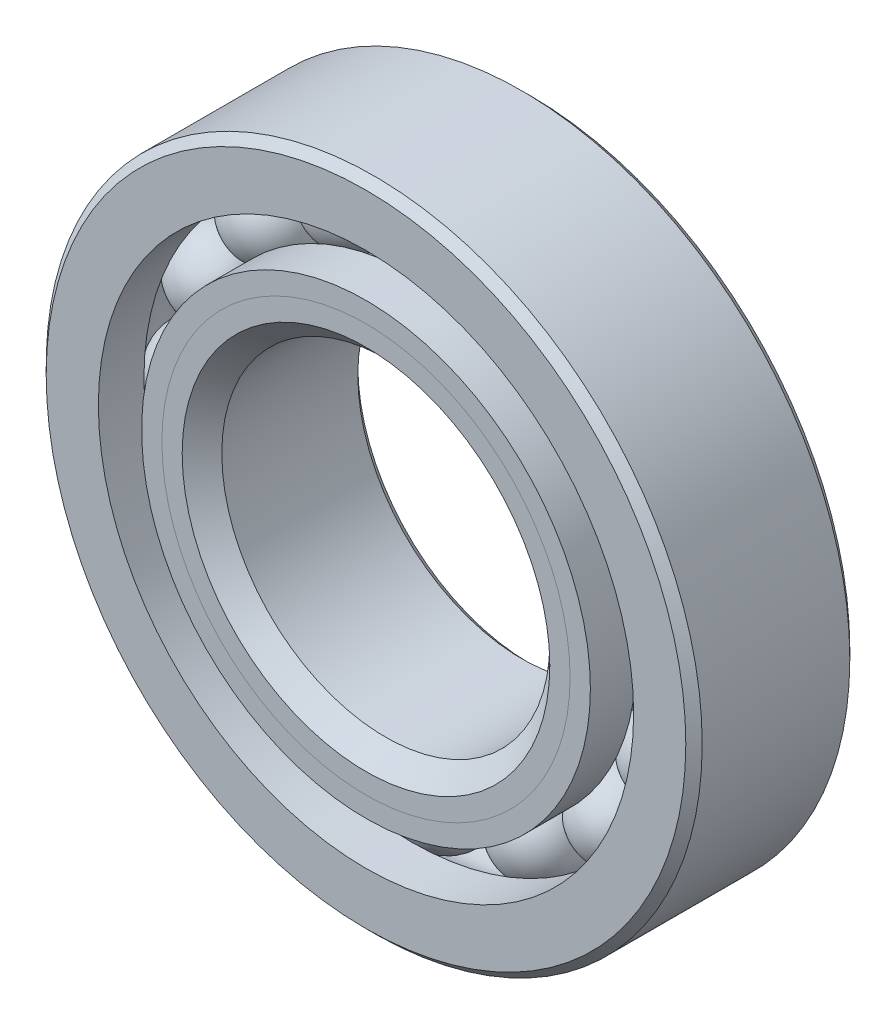
ISO-10303-21;
HEADER;
FILE_DESCRIPTION(('STEP AP214'),'2;1');
FILE_NAME('part.step','',(''),(''),'','','');
FILE_SCHEMA(('AUTOMOTIVE_DESIGN { 1 0 10303 214 1 1 1 1 }'));
ENDSEC;
DATA;
#1=APPLICATION_CONTEXT('core data for automotive mechanical design processes');
#2=APPLICATION_PROTOCOL_DEFINITION('international standard','automotive_design',2000,#1);
#3=PRODUCT_CONTEXT('',#1,'mechanical');
#4=PRODUCT('Part','Part','',(#3));
#5=PRODUCT_RELATED_PRODUCT_CATEGORY('part','',(#4));
#6=PRODUCT_DEFINITION_FORMATION('','',#4);
#7=PRODUCT_DEFINITION_CONTEXT('part definition',#1,'design');
#8=PRODUCT_DEFINITION('design','',#6,#7);
#9=PRODUCT_DEFINITION_SHAPE('','',#8);
#10=(LENGTH_UNIT() NAMED_UNIT(*) SI_UNIT(.MILLI.,.METRE.));
#11=(NAMED_UNIT(*) PLANE_ANGLE_UNIT() SI_UNIT($,.RADIAN.));
#12=(NAMED_UNIT(*) SI_UNIT($,.STERADIAN.) SOLID_ANGLE_UNIT());
#13=UNCERTAINTY_MEASURE_WITH_UNIT(LENGTH_MEASURE(1.E-05),#10,'distance_accuracy_value','');
#14=(GEOMETRIC_REPRESENTATION_CONTEXT(3) GLOBAL_UNCERTAINTY_ASSIGNED_CONTEXT((#13)) GLOBAL_UNIT_ASSIGNED_CONTEXT((#10,
#11,#12)) REPRESENTATION_CONTEXT('',''));
#15=CARTESIAN_POINT('',(0.,0.,0.));
#16=DIRECTION('',(0.,0.,1.));
#17=DIRECTION('',(1.,0.,0.));
#18=AXIS2_PLACEMENT_3D('',#15,#16,#17);
#19=CARTESIAN_POINT('',(-1.82252984663868,4.39997627358503,0.));
#20=DIRECTION('',(0.,0.,1.));
#21=DIRECTION('',(-0.382683432365077,0.923879532511292,0.));
#22=AXIS2_PLACEMENT_3D('',#19,#20,#21);
#23=SPHERICAL_SURFACE('',#22,0.820428356767388);
#24=CARTESIAN_POINT('',(-1.82252984663868,4.39997627358503,0.820428356767388));
#25=VERTEX_POINT('',#24);
#26=VERTEX_LOOP('',#25);
#27=FACE_BOUND('',#26,.T.);
#28=ADVANCED_FACE('F37',(#27),#23,.T.);
#29=CLOSED_SHELL('',(#28));
#30=MANIFOLD_SOLID_BREP('B2',#29);
#31=CARTESIAN_POINT('',(-3.36759604540089,3.36759604540097,0.));
#32=DIRECTION('',(0.,0.,1.));
#33=DIRECTION('',(-0.707106781186539,0.707106781186556,0.));
#34=AXIS2_PLACEMENT_3D('',#31,#32,#33);
#35=SPHERICAL_SURFACE('',#34,0.820428356767388);
#36=CARTESIAN_POINT('',(-3.36759604540089,3.36759604540097,0.820428356767388));
#37=VERTEX_POINT('',#36);
#38=VERTEX_LOOP('',#37);
#39=FACE_BOUND('',#38,.T.);
#40=ADVANCED_FACE('F57',(#39),#35,.T.);
#41=CLOSED_SHELL('',(#40));
#42=MANIFOLD_SOLID_BREP('B6',#41);
#43=CARTESIAN_POINT('',(-4.39997627358498,1.82252984663879,0.));
#44=DIRECTION('',(0.,0.,1.));
#45=DIRECTION('',(-0.923879532511283,0.3826834323651,0.));
#46=AXIS2_PLACEMENT_3D('',#43,#44,#45);
#47=SPHERICAL_SURFACE('',#46,0.820428356767388);
#48=CARTESIAN_POINT('',(-4.39997627358498,1.82252984663879,0.820428356767388));
#49=VERTEX_POINT('',#48);
#50=VERTEX_LOOP('',#49);
#51=FACE_BOUND('',#50,.T.);
#52=ADVANCED_FACE('F77',(#51),#47,.T.);
#53=CLOSED_SHELL('',(#52));
#54=MANIFOLD_SOLID_BREP('B33',#53);
#55=CARTESIAN_POINT('',(-4.7625,0.,0.));
#56=DIRECTION('',(0.,0.,1.));
#57=DIRECTION('',(-1.,0.,0.));
#58=AXIS2_PLACEMENT_3D('',#55,#56,#57);
#59=SPHERICAL_SURFACE('',#58,0.820428356767388);
#60=CARTESIAN_POINT('',(-4.7625,0.,0.820428356767388));
#61=VERTEX_POINT('',#60);
#62=VERTEX_LOOP('',#61);
#63=FACE_BOUND('',#62,.T.);
#64=ADVANCED_FACE('F97',(#63),#59,.T.);
#65=CLOSED_SHELL('',(#64));
#66=MANIFOLD_SOLID_BREP('B53',#65);
#67=CARTESIAN_POINT('',(-4.39997627358502,-1.8225298466387,0.));
#68=DIRECTION('',(0.,0.,1.));
#69=DIRECTION('',(-0.923879532511291,-0.382683432365081,0.));
#70=AXIS2_PLACEMENT_3D('',#67,#68,#69);
#71=SPHERICAL_SURFACE('',#70,0.820428356767388);
#72=CARTESIAN_POINT('',(-4.39997627358502,-1.8225298466387,0.820428356767388));
#73=VERTEX_POINT('',#72);
#74=VERTEX_LOOP('',#73);
#75=FACE_BOUND('',#74,.T.);
#76=ADVANCED_FACE('F117',(#75),#71,.T.);
#77=CLOSED_SHELL('',(#76));
#78=MANIFOLD_SOLID_BREP('B73',#77);
#79=CARTESIAN_POINT('',(-3.36759604540096,-3.3675960454009,0.));
#80=DIRECTION('',(0.,0.,1.));
#81=DIRECTION('',(-0.707106781186554,-0.707106781186541,0.));
#82=AXIS2_PLACEMENT_3D('',#79,#80,#81);
#83=SPHERICAL_SURFACE('',#82,0.820428356767388);
#84=CARTESIAN_POINT('',(-3.36759604540096,-3.3675960454009,0.820428356767388));
#85=VERTEX_POINT('',#84);
#86=VERTEX_LOOP('',#85);
#87=FACE_BOUND('',#86,.T.);
#88=ADVANCED_FACE('F148',(#87),#83,.T.);
#89=CLOSED_SHELL('',(#88));
#90=MANIFOLD_SOLID_BREP('B93',#89);
#91=CARTESIAN_POINT('',(-1.82252984663877,-4.39997627358499,0.));
#92=DIRECTION('',(0.,0.,1.));
#93=DIRECTION('',(-0.382683432365097,-0.923879532511284,0.));
#94=AXIS2_PLACEMENT_3D('',#91,#92,#93);
#95=SPHERICAL_SURFACE('',#94,0.820428356767388);
#96=CARTESIAN_POINT('',(-1.82252984663877,-4.39997627358499,0.820428356767388));
#97=VERTEX_POINT('',#96);
#98=VERTEX_LOOP('',#97);
#99=FACE_BOUND('',#98,.T.);
#100=ADVANCED_FACE('F179',(#99),#95,.T.);
#101=CLOSED_SHELL('',(#100));
#102=MANIFOLD_SOLID_BREP('B113',#101);
#103=CARTESIAN_POINT('',(0.,-4.7625,0.));
#104=DIRECTION('',(0.,0.,1.));
#105=DIRECTION('',(0.,-1.,0.));
#106=AXIS2_PLACEMENT_3D('',#103,#104,#105);
#107=SPHERICAL_SURFACE('',#106,0.820428356767388);
#108=CARTESIAN_POINT('',(0.,-4.7625,0.820428356767388));
#109=VERTEX_POINT('',#108);
#110=VERTEX_LOOP('',#109);
#111=FACE_BOUND('',#110,.T.);
#112=ADVANCED_FACE('F210',(#111),#107,.T.);
#113=CLOSED_SHELL('',(#112));
#114=MANIFOLD_SOLID_BREP('B144',#113);
#115=CARTESIAN_POINT('',(1.82252984663871,-4.39997627358501,0.));
#116=DIRECTION('',(0.,0.,1.));
#117=DIRECTION('',(0.382683432365084,-0.923879532511289,0.));
#118=AXIS2_PLACEMENT_3D('',#115,#116,#117);
#119=SPHERICAL_SURFACE('',#118,0.820428356767388);
#120=CARTESIAN_POINT('',(1.82252984663871,-4.39997627358501,0.820428356767388));
#121=VERTEX_POINT('',#120);
#122=VERTEX_LOOP('',#121);
#123=FACE_BOUND('',#122,.T.);
#124=ADVANCED_FACE('F241',(#123),#119,.T.);
#125=CLOSED_SHELL('',(#124));
#126=MANIFOLD_SOLID_BREP('B175',#125);
#127=CARTESIAN_POINT('',(3.36759604540091,-3.36759604540095,0.));
#128=DIRECTION('',(0.,0.,1.));
#129=DIRECTION('',(0.707106781186544,-0.707106781186551,0.));
#130=AXIS2_PLACEMENT_3D('',#127,#128,#129);
#131=SPHERICAL_SURFACE('',#130,0.820428356767388);
#132=CARTESIAN_POINT('',(3.36759604540091,-3.36759604540095,0.820428356767388));
#133=VERTEX_POINT('',#132);
#134=VERTEX_LOOP('',#133);
#135=FACE_BOUND('',#134,.T.);
#136=ADVANCED_FACE('F272',(#135),#131,.T.);
#137=CLOSED_SHELL('',(#136));
#138=MANIFOLD_SOLID_BREP('B206',#137);
#139=CARTESIAN_POINT('',(4.399976273585,-1.82252984663876,0.));
#140=DIRECTION('',(0.,0.,1.));
#141=DIRECTION('',(0.923879532511285,-0.382683432365094,0.));
#142=AXIS2_PLACEMENT_3D('',#139,#140,#141);
#143=SPHERICAL_SURFACE('',#142,0.820428356767388);
#144=CARTESIAN_POINT('',(4.399976273585,-1.82252984663876,0.820428356767388));
#145=VERTEX_POINT('',#144);
#146=VERTEX_LOOP('',#145);
#147=FACE_BOUND('',#146,.T.);
#148=ADVANCED_FACE('F303',(#147),#143,.T.);
#149=CLOSED_SHELL('',(#148));
#150=MANIFOLD_SOLID_BREP('B237',#149);
#151=CARTESIAN_POINT('',(4.7625,0.,0.));
#152=DIRECTION('',(0.,0.,1.));
#153=DIRECTION('',(1.,0.,0.));
#154=AXIS2_PLACEMENT_3D('',#151,#152,#153);
#155=SPHERICAL_SURFACE('',#154,0.820428356767388);
#156=CARTESIAN_POINT('',(4.7625,0.,0.820428356767388));
#157=VERTEX_POINT('',#156);
#158=VERTEX_LOOP('',#157);
#159=FACE_BOUND('',#158,.T.);
#160=ADVANCED_FACE('F334',(#159),#155,.T.);
#161=CLOSED_SHELL('',(#160));
#162=MANIFOLD_SOLID_BREP('B268',#161);
#163=CARTESIAN_POINT('',(4.39997627358501,1.82252984663873,0.));
#164=DIRECTION('',(0.,0.,1.));
#165=DIRECTION('',(0.923879532511288,0.382683432365087,0.));
#166=AXIS2_PLACEMENT_3D('',#163,#164,#165);
#167=SPHERICAL_SURFACE('',#166,0.820428356767388);
#168=CARTESIAN_POINT('',(4.39997627358501,1.82252984663873,0.820428356767388));
#169=VERTEX_POINT('',#168);
#170=VERTEX_LOOP('',#169);
#171=FACE_BOUND('',#170,.T.);
#172=ADVANCED_FACE('F365',(#171),#167,.T.);
#173=CLOSED_SHELL('',(#172));
#174=MANIFOLD_SOLID_BREP('B299',#173);
#175=CARTESIAN_POINT('',(3.36759604540094,3.36759604540093,0.));
#176=DIRECTION('',(0.,0.,1.));
#177=DIRECTION('',(0.707106781186549,0.707106781186546,0.));
#178=AXIS2_PLACEMENT_3D('',#175,#176,#177);
#179=SPHERICAL_SURFACE('',#178,0.820428356767388);
#180=CARTESIAN_POINT('',(3.36759604540094,3.36759604540093,0.820428356767388));
#181=VERTEX_POINT('',#180);
#182=VERTEX_LOOP('',#181);
#183=FACE_BOUND('',#182,.T.);
#184=ADVANCED_FACE('F396',(#183),#179,.T.);
#185=CLOSED_SHELL('',(#184));
#186=MANIFOLD_SOLID_BREP('B330',#185);
#187=CARTESIAN_POINT('',(1.82252984663874,4.399976273585,0.));
#188=DIRECTION('',(0.,0.,1.));
#189=DIRECTION('',(0.382683432365091,0.923879532511287,0.));
#190=AXIS2_PLACEMENT_3D('',#187,#188,#189);
#191=SPHERICAL_SURFACE('',#190,0.820428356767388);
#192=CARTESIAN_POINT('',(1.82252984663874,4.399976273585,0.820428356767388));
#193=VERTEX_POINT('',#192);
#194=VERTEX_LOOP('',#193);
#195=FACE_BOUND('',#194,.T.);
#196=ADVANCED_FACE('F427',(#195),#191,.T.);
#197=CLOSED_SHELL('',(#196));
#198=MANIFOLD_SOLID_BREP('B361',#197);
#199=CARTESIAN_POINT('',(0.,4.7625,0.));
#200=DIRECTION('',(0.,0.,1.));
#201=DIRECTION('',(0.,1.,0.));
#202=AXIS2_PLACEMENT_3D('',#199,#200,#201);
#203=SPHERICAL_SURFACE('',#202,0.820428356767388);
#204=CARTESIAN_POINT('',(0.,4.7625,0.820428356767388));
#205=VERTEX_POINT('',#204);
#206=VERTEX_LOOP('',#205);
#207=FACE_BOUND('',#206,.T.);
#208=ADVANCED_FACE('F460',(#207),#203,.T.);
#209=CLOSED_SHELL('',(#208));
#210=MANIFOLD_SOLID_BREP('B392',#209);
#211=CARTESIAN_POINT('',(0.,3.95117725146749,1.5875));
#212=DIRECTION('',(0.,0.,-1.));
#213=DIRECTION('',(-1.,0.,0.));
#214=AXIS2_PLACEMENT_3D('',#211,#212,#213);
#215=PLANE('',#214);
#216=CARTESIAN_POINT('',(0.,0.,1.5875));
#217=DIRECTION('',(0.,0.,1.));
#218=DIRECTION('',(1.,0.,0.));
#219=AXIS2_PLACEMENT_3D('',#216,#217,#218);
#220=CIRCLE('',#219,3.55853582161631);
#221=CARTESIAN_POINT('',(3.55853582161631,0.,1.5875));
#222=VERTEX_POINT('',#221);
#223=EDGE_CURVE('E514',#222,#222,#220,.T.);
#224=ORIENTED_EDGE('',*,*,#223,.F.);
#225=EDGE_LOOP('',(#224));
#226=FACE_BOUND('',#225,.T.);
#227=CARTESIAN_POINT('',(0.,0.,1.5875));
#228=DIRECTION('',(0.,0.,1.));
#229=DIRECTION('',(1.,0.,0.));
#230=AXIS2_PLACEMENT_3D('',#227,#228,#229);
#231=CIRCLE('',#230,3.95117725146749);
#232=CARTESIAN_POINT('',(3.95117725146749,0.,1.5875));
#233=VERTEX_POINT('',#232);
#234=EDGE_CURVE('E459',#233,#233,#231,.T.);
#235=ORIENTED_EDGE('',*,*,#234,.T.);
#236=EDGE_LOOP('',(#235));
#237=FACE_BOUND('',#236,.T.);
#238=ADVANCED_FACE('F480',(#226,#237),#215,.F.);
#239=CARTESIAN_POINT('',(0.,0.,1.19485857014881));
#240=DIRECTION('',(0.,0.,1.));
#241=DIRECTION('',(1.,0.,0.));
#242=AXIS2_PLACEMENT_3D('',#239,#240,#241);
#243=CONICAL_SURFACE('',#242,3.55853582161631,0.78539816339745);
#244=ORIENTED_EDGE('',*,*,#234,.F.);
#245=EDGE_LOOP('',(#244));
#246=FACE_BOUND('',#245,.T.);
#247=CARTESIAN_POINT('',(0.,0.,1.19485857014881));
#248=DIRECTION('',(0.,0.,1.));
#249=DIRECTION('',(1.,0.,0.));
#250=AXIS2_PLACEMENT_3D('',#247,#248,#249);
#251=CIRCLE('',#250,3.55853582161631);
#252=CARTESIAN_POINT('',(3.55853582161631,0.,1.19485857014881));
#253=VERTEX_POINT('',#252);
#254=EDGE_CURVE('E486',#253,#253,#251,.T.);
#255=ORIENTED_EDGE('',*,*,#254,.T.);
#256=EDGE_LOOP('',(#255));
#257=FACE_BOUND('',#256,.T.);
#258=ADVANCED_FACE('F521',(#246,#257),#243,.T.);
#259=CARTESIAN_POINT('',(0.,0.,1.5875));
#260=DIRECTION('',(0.,0.,1.));
#261=DIRECTION('',(1.,0.,0.));
#262=AXIS2_PLACEMENT_3D('',#259,#260,#261);
#263=CYLINDRICAL_SURFACE('',#262,3.55853582161631);
#264=ORIENTED_EDGE('',*,*,#254,.F.);
#265=EDGE_LOOP('',(#264));
#266=FACE_BOUND('',#265,.T.);
#267=CARTESIAN_POINT('',(0.,0.,0.));
#268=DIRECTION('',(0.,0.,1.));
#269=DIRECTION('',(1.,0.,0.));
#270=AXIS2_PLACEMENT_3D('',#267,#268,#269);
#271=CIRCLE('',#270,3.55853582161631);
#272=CARTESIAN_POINT('',(3.55853582161631,0.,0.));
#273=VERTEX_POINT('',#272);
#274=EDGE_CURVE('E490',#273,#273,#271,.T.);
#275=ORIENTED_EDGE('',*,*,#274,.T.);
#276=EDGE_LOOP('',(#275));
#277=FACE_BOUND('',#276,.T.);
#278=ADVANCED_FACE('F525',(#266,#277),#263,.T.);
#279=CARTESIAN_POINT('',(0.,3.55853582161631,0.));
#280=DIRECTION('',(0.,0.,-1.));
#281=DIRECTION('',(-1.,0.,0.));
#282=AXIS2_PLACEMENT_3D('',#279,#280,#281);
#283=PLANE('',#282);
#284=ORIENTED_EDGE('',*,*,#274,.F.);
#285=EDGE_LOOP('',(#284));
#286=FACE_BOUND('',#285,.T.);
#287=CARTESIAN_POINT('',(0.,0.,0.));
#288=DIRECTION('',(0.,0.,1.));
#289=DIRECTION('',(1.,0.,0.));
#290=AXIS2_PLACEMENT_3D('',#287,#288,#289);
#291=CIRCLE('',#290,3.94207164323261);
#292=CARTESIAN_POINT('',(3.94207164323261,0.,0.));
#293=VERTEX_POINT('',#292);
#294=EDGE_CURVE('E494',#293,#293,#291,.T.);
#295=ORIENTED_EDGE('',*,*,#294,.T.);
#296=EDGE_LOOP('',(#295));
#297=FACE_BOUND('',#296,.T.);
#298=ADVANCED_FACE('F530',(#286,#297),#283,.F.);
#299=CARTESIAN_POINT('',(0.,0.,0.));
#300=DIRECTION('',(0.,0.,1.));
#301=DIRECTION('',(1.,0.,0.));
#302=AXIS2_PLACEMENT_3D('',#299,#300,#301);
#303=TOROIDAL_SURFACE('',#302,4.7625,0.820428356767388);
#304=ORIENTED_EDGE('',*,*,#294,.F.);
#305=EDGE_LOOP('',(#304));
#306=FACE_BOUND('',#305,.T.);
#307=CARTESIAN_POINT('',(0.,0.,-0.705555555555556));
#308=DIRECTION('',(0.,0.,1.));
#309=DIRECTION('',(1.,0.,0.));
#310=AXIS2_PLACEMENT_3D('',#307,#308,#309);
#311=CIRCLE('',#310,4.34381868131868);
#312=CARTESIAN_POINT('',(4.34381868131868,0.,-0.705555555555556));
#313=VERTEX_POINT('',#312);
#314=EDGE_CURVE('E499',#313,#313,#311,.T.);
#315=ORIENTED_EDGE('',*,*,#314,.T.);
#316=EDGE_LOOP('',(#315));
#317=FACE_BOUND('',#316,.T.);
#318=ADVANCED_FACE('F536',(#306,#317),#303,.F.);
#319=CARTESIAN_POINT('',(0.,0.,1.5875));
#320=DIRECTION('',(0.,0.,1.));
#321=DIRECTION('',(1.,0.,0.));
#322=AXIS2_PLACEMENT_3D('',#319,#320,#321);
#323=CYLINDRICAL_SURFACE('',#322,4.34381868131868);
#324=ORIENTED_EDGE('',*,*,#314,.F.);
#325=EDGE_LOOP('',(#324));
#326=FACE_BOUND('',#325,.T.);
#327=CARTESIAN_POINT('',(0.,0.,-1.5875));
#328=DIRECTION('',(0.,0.,1.));
#329=DIRECTION('',(1.,0.,0.));
#330=AXIS2_PLACEMENT_3D('',#327,#328,#329);
#331=CIRCLE('',#330,4.34381868131868);
#332=CARTESIAN_POINT('',(4.34381868131868,0.,-1.5875));
#333=VERTEX_POINT('',#332);
#334=EDGE_CURVE('E502',#333,#333,#331,.T.);
#335=ORIENTED_EDGE('',*,*,#334,.T.);
#336=EDGE_LOOP('',(#335));
#337=FACE_BOUND('',#336,.T.);
#338=ADVANCED_FACE('F540',(#326,#337),#323,.T.);
#339=CARTESIAN_POINT('',(0.,3.33375,-1.5875));
#340=DIRECTION('',(0.,0.,1.));
#341=DIRECTION('',(1.,0.,0.));
#342=AXIS2_PLACEMENT_3D('',#339,#340,#341);
#343=PLANE('',#342);
#344=ORIENTED_EDGE('',*,*,#334,.F.);
#345=EDGE_LOOP('',(#344));
#346=FACE_BOUND('',#345,.T.);
#347=CARTESIAN_POINT('',(0.,0.,-1.5875));
#348=DIRECTION('',(0.,0.,1.));
#349=DIRECTION('',(1.,0.,0.));
#350=AXIS2_PLACEMENT_3D('',#347,#348,#349);
#351=CIRCLE('',#350,3.33375);
#352=CARTESIAN_POINT('',(3.33375,0.,-1.5875));
#353=VERTEX_POINT('',#352);
#354=EDGE_CURVE('E505',#353,#353,#351,.T.);
#355=ORIENTED_EDGE('',*,*,#354,.T.);
#356=EDGE_LOOP('',(#355));
#357=FACE_BOUND('',#356,.T.);
#358=ADVANCED_FACE('F544',(#346,#357),#343,.F.);
#359=CARTESIAN_POINT('',(0.,0.,-1.42875));
#360=DIRECTION('',(0.,0.,-1.));
#361=DIRECTION('',(-1.,0.,0.));
#362=AXIS2_PLACEMENT_3D('',#359,#360,#361);
#363=CONICAL_SURFACE('',#362,3.175,0.785398163397444);
#364=ORIENTED_EDGE('',*,*,#354,.F.);
#365=EDGE_LOOP('',(#364));
#366=FACE_BOUND('',#365,.T.);
#367=CARTESIAN_POINT('',(0.,0.,-1.42875));
#368=DIRECTION('',(0.,0.,1.));
#369=DIRECTION('',(1.,0.,0.));
#370=AXIS2_PLACEMENT_3D('',#367,#368,#369);
#371=CIRCLE('',#370,3.175);
#372=CARTESIAN_POINT('',(3.175,0.,-1.42875));
#373=VERTEX_POINT('',#372);
#374=EDGE_CURVE('E508',#373,#373,#371,.T.);
#375=ORIENTED_EDGE('',*,*,#374,.T.);
#376=EDGE_LOOP('',(#375));
#377=FACE_BOUND('',#376,.T.);
#378=ADVANCED_FACE('F548',(#366,#377),#363,.F.);
#379=CARTESIAN_POINT('',(0.,0.,1.5875));
#380=DIRECTION('',(0.,0.,1.));
#381=DIRECTION('',(1.,0.,0.));
#382=AXIS2_PLACEMENT_3D('',#379,#380,#381);
#383=CYLINDRICAL_SURFACE('',#382,3.175);
#384=ORIENTED_EDGE('',*,*,#374,.F.);
#385=EDGE_LOOP('',(#384));
#386=FACE_BOUND('',#385,.T.);
#387=CARTESIAN_POINT('',(0.,0.,1.2039641783837));
#388=DIRECTION('',(0.,0.,1.));
#389=DIRECTION('',(1.,0.,0.));
#390=AXIS2_PLACEMENT_3D('',#387,#388,#389);
#391=CIRCLE('',#390,3.175);
#392=CARTESIAN_POINT('',(3.175,0.,1.2039641783837));
#393=VERTEX_POINT('',#392);
#394=EDGE_CURVE('E511',#393,#393,#391,.T.);
#395=ORIENTED_EDGE('',*,*,#394,.T.);
#396=EDGE_LOOP('',(#395));
#397=FACE_BOUND('',#396,.T.);
#398=ADVANCED_FACE('F552',(#386,#397),#383,.F.);
#399=CARTESIAN_POINT('',(0.,0.,1.5875));
#400=DIRECTION('',(0.,0.,1.));
#401=DIRECTION('',(1.,0.,0.));
#402=AXIS2_PLACEMENT_3D('',#399,#400,#401);
#403=CONICAL_SURFACE('',#402,3.55853582161631,0.785398163397451);
#404=ORIENTED_EDGE('',*,*,#394,.F.);
#405=EDGE_LOOP('',(#404));
#406=FACE_BOUND('',#405,.T.);
#407=ORIENTED_EDGE('',*,*,#223,.T.);
#408=EDGE_LOOP('',(#407));
#409=FACE_BOUND('',#408,.T.);
#410=ADVANCED_FACE('F518',(#406,#409),#403,.F.);
#411=CLOSED_SHELL('',(#238,#258,#278,#298,#318,#338,#358,#378,#398,#410));
#412=MANIFOLD_SOLID_BREP('B423',#411);
#413=CARTESIAN_POINT('',(0.,4.34381868131868,1.5875));
#414=DIRECTION('',(0.,0.,-1.));
#415=DIRECTION('',(-1.,0.,0.));
#416=AXIS2_PLACEMENT_3D('',#413,#414,#415);
#417=PLANE('',#416);
#418=CARTESIAN_POINT('',(0.,0.,1.5875));
#419=DIRECTION('',(0.,0.,1.));
#420=DIRECTION('',(1.,0.,0.));
#421=AXIS2_PLACEMENT_3D('',#418,#419,#420);
#422=CIRCLE('',#421,3.95117725146749);
#423=CARTESIAN_POINT('',(3.95117725146749,0.,1.5875));
#424=VERTEX_POINT('',#423);
#425=EDGE_CURVE('E479',#424,#424,#422,.T.);
#426=ORIENTED_EDGE('',*,*,#425,.F.);
#427=EDGE_LOOP('',(#426));
#428=FACE_BOUND('',#427,.T.);
#429=CARTESIAN_POINT('',(0.,0.,1.5875));
#430=DIRECTION('',(0.,0.,1.));
#431=DIRECTION('',(1.,0.,0.));
#432=AXIS2_PLACEMENT_3D('',#429,#430,#431);
#433=CIRCLE('',#432,4.34381868131868);
#434=CARTESIAN_POINT('',(4.34381868131868,0.,1.5875));
#435=VERTEX_POINT('',#434);
#436=EDGE_CURVE('E660',#435,#435,#433,.T.);
#437=ORIENTED_EDGE('',*,*,#436,.T.);
#438=EDGE_LOOP('',(#437));
#439=FACE_BOUND('',#438,.T.);
#440=ADVANCED_FACE('F638',(#428,#439),#417,.F.);
#441=CARTESIAN_POINT('',(0.,0.,1.5875));
#442=DIRECTION('',(0.,0.,1.));
#443=DIRECTION('',(1.,0.,0.));
#444=AXIS2_PLACEMENT_3D('',#441,#442,#443);
#445=CONICAL_SURFACE('',#444,3.95117725146749,0.78539816339745);
#446=CARTESIAN_POINT('',(0.,0.,1.19485857014881));
#447=DIRECTION('',(0.,0.,1.));
#448=DIRECTION('',(1.,0.,0.));
#449=AXIS2_PLACEMENT_3D('',#446,#447,#448);
#450=CIRCLE('',#449,3.55853582161631);
#451=CARTESIAN_POINT('',(3.55853582161631,0.,1.19485857014881));
#452=VERTEX_POINT('',#451);
#453=EDGE_CURVE('E644',#452,#452,#450,.T.);
#454=ORIENTED_EDGE('',*,*,#453,.F.);
#455=EDGE_LOOP('',(#454));
#456=FACE_BOUND('',#455,.T.);
#457=ORIENTED_EDGE('',*,*,#425,.T.);
#458=EDGE_LOOP('',(#457));
#459=FACE_BOUND('',#458,.T.);
#460=ADVANCED_FACE('F685',(#456,#459),#445,.F.);
#461=CARTESIAN_POINT('',(0.,0.,1.5875));
#462=DIRECTION('',(0.,0.,1.));
#463=DIRECTION('',(1.,0.,0.));
#464=AXIS2_PLACEMENT_3D('',#461,#462,#463);
#465=CYLINDRICAL_SURFACE('',#464,3.55853582161631);
#466=CARTESIAN_POINT('',(0.,0.,0.));
#467=DIRECTION('',(0.,0.,1.));
#468=DIRECTION('',(1.,0.,0.));
#469=AXIS2_PLACEMENT_3D('',#466,#467,#468);
#470=CIRCLE('',#469,3.55853582161631);
#471=CARTESIAN_POINT('',(3.55853582161631,0.,0.));
#472=VERTEX_POINT('',#471);
#473=EDGE_CURVE('E648',#472,#472,#470,.T.);
#474=ORIENTED_EDGE('',*,*,#473,.F.);
#475=EDGE_LOOP('',(#474));
#476=FACE_BOUND('',#475,.T.);
#477=ORIENTED_EDGE('',*,*,#453,.T.);
#478=EDGE_LOOP('',(#477));
#479=FACE_BOUND('',#478,.T.);
#480=ADVANCED_FACE('F680',(#476,#479),#465,.F.);
#481=CARTESIAN_POINT('',(0.,3.55853582161631,0.));
#482=DIRECTION('',(0.,0.,1.));
#483=DIRECTION('',(1.,0.,0.));
#484=AXIS2_PLACEMENT_3D('',#481,#482,#483);
#485=PLANE('',#484);
#486=CARTESIAN_POINT('',(0.,0.,0.));
#487=DIRECTION('',(0.,0.,1.));
#488=DIRECTION('',(1.,0.,0.));
#489=AXIS2_PLACEMENT_3D('',#486,#487,#488);
#490=CIRCLE('',#489,3.94207164323261);
#491=CARTESIAN_POINT('',(3.94207164323261,0.,0.));
#492=VERTEX_POINT('',#491);
#493=EDGE_CURVE('E652',#492,#492,#490,.T.);
#494=ORIENTED_EDGE('',*,*,#493,.F.);
#495=EDGE_LOOP('',(#494));
#496=FACE_BOUND('',#495,.T.);
#497=ORIENTED_EDGE('',*,*,#473,.T.);
#498=EDGE_LOOP('',(#497));
#499=FACE_BOUND('',#498,.T.);
#500=ADVANCED_FACE('F674',(#496,#499),#485,.F.);
#501=CARTESIAN_POINT('',(0.,0.,0.));
#502=DIRECTION('',(0.,0.,1.));
#503=DIRECTION('',(1.,0.,0.));
#504=AXIS2_PLACEMENT_3D('',#501,#502,#503);
#505=TOROIDAL_SURFACE('',#504,4.7625,0.820428356767388);
#506=CARTESIAN_POINT('',(0.,0.,0.705555555555555));
#507=DIRECTION('',(0.,0.,1.));
#508=DIRECTION('',(1.,0.,0.));
#509=AXIS2_PLACEMENT_3D('',#506,#507,#508);
#510=CIRCLE('',#509,4.34381868131868);
#511=CARTESIAN_POINT('',(4.34381868131868,0.,0.705555555555555));
#512=VERTEX_POINT('',#511);
#513=EDGE_CURVE('E657',#512,#512,#510,.T.);
#514=ORIENTED_EDGE('',*,*,#513,.F.);
#515=EDGE_LOOP('',(#514));
#516=FACE_BOUND('',#515,.T.);
#517=ORIENTED_EDGE('',*,*,#493,.T.);
#518=EDGE_LOOP('',(#517));
#519=FACE_BOUND('',#518,.T.);
#520=ADVANCED_FACE('F668',(#516,#519),#505,.F.);
#521=CARTESIAN_POINT('',(0.,0.,1.5875));
#522=DIRECTION('',(0.,0.,1.));
#523=DIRECTION('',(1.,0.,0.));
#524=AXIS2_PLACEMENT_3D('',#521,#522,#523);
#525=CYLINDRICAL_SURFACE('',#524,4.34381868131868);
#526=ORIENTED_EDGE('',*,*,#436,.F.);
#527=EDGE_LOOP('',(#526));
#528=FACE_BOUND('',#527,.T.);
#529=ORIENTED_EDGE('',*,*,#513,.T.);
#530=EDGE_LOOP('',(#529));
#531=FACE_BOUND('',#530,.T.);
#532=ADVANCED_FACE('F665',(#528,#531),#525,.T.);
#533=CLOSED_SHELL('',(#440,#460,#480,#500,#520,#532));
#534=MANIFOLD_SOLID_BREP('B454',#533);
#535=CARTESIAN_POINT('',(0.,0.,1.42875));
#536=DIRECTION('',(0.,0.,-1.));
#537=DIRECTION('',(-1.,0.,0.));
#538=AXIS2_PLACEMENT_3D('',#535,#536,#537);
#539=CONICAL_SURFACE('',#538,6.35,0.785398163397446);
#540=CARTESIAN_POINT('',(0.,0.,1.5875));
#541=DIRECTION('',(0.,0.,1.));
#542=DIRECTION('',(1.,0.,0.));
#543=AXIS2_PLACEMENT_3D('',#540,#541,#542);
#544=CIRCLE('',#543,6.19125);
#545=CARTESIAN_POINT('',(6.19125,0.,1.5875));
#546=VERTEX_POINT('',#545);
#547=EDGE_CURVE('E757',#546,#546,#544,.T.);
#548=ORIENTED_EDGE('',*,*,#547,.F.);
#549=EDGE_LOOP('',(#548));
#550=FACE_BOUND('',#549,.T.);
#551=CARTESIAN_POINT('',(0.,0.,1.42875));
#552=DIRECTION('',(0.,0.,1.));
#553=DIRECTION('',(1.,0.,0.));
#554=AXIS2_PLACEMENT_3D('',#551,#552,#553);
#555=CIRCLE('',#554,6.35);
#556=CARTESIAN_POINT('',(6.35,0.,1.42875));
#557=VERTEX_POINT('',#556);
#558=EDGE_CURVE('E637',#557,#557,#555,.T.);
#559=ORIENTED_EDGE('',*,*,#558,.T.);
#560=EDGE_LOOP('',(#559));
#561=FACE_BOUND('',#560,.T.);
#562=ADVANCED_FACE('F729',(#550,#561),#539,.T.);
#563=CARTESIAN_POINT('',(0.,0.,1.5875));
#564=DIRECTION('',(0.,0.,1.));
#565=DIRECTION('',(1.,0.,0.));
#566=AXIS2_PLACEMENT_3D('',#563,#564,#565);
#567=CYLINDRICAL_SURFACE('',#566,6.35);
#568=ORIENTED_EDGE('',*,*,#558,.F.);
#569=EDGE_LOOP('',(#568));
#570=FACE_BOUND('',#569,.T.);
#571=CARTESIAN_POINT('',(0.,0.,-1.42875));
#572=DIRECTION('',(0.,0.,1.));
#573=DIRECTION('',(1.,0.,0.));
#574=AXIS2_PLACEMENT_3D('',#571,#572,#573);
#575=CIRCLE('',#574,6.35);
#576=CARTESIAN_POINT('',(6.35,0.,-1.42875));
#577=VERTEX_POINT('',#576);
#578=EDGE_CURVE('E735',#577,#577,#575,.T.);
#579=ORIENTED_EDGE('',*,*,#578,.T.);
#580=EDGE_LOOP('',(#579));
#581=FACE_BOUND('',#580,.T.);
#582=ADVANCED_FACE('F764',(#570,#581),#567,.T.);
#583=CARTESIAN_POINT('',(0.,0.,-1.5875));
#584=DIRECTION('',(0.,0.,1.));
#585=DIRECTION('',(1.,0.,0.));
#586=AXIS2_PLACEMENT_3D('',#583,#584,#585);
#587=CONICAL_SURFACE('',#586,6.19125,0.785398163397446);
#588=ORIENTED_EDGE('',*,*,#578,.F.);
#589=EDGE_LOOP('',(#588));
#590=FACE_BOUND('',#589,.T.);
#591=CARTESIAN_POINT('',(0.,0.,-1.5875));
#592=DIRECTION('',(0.,0.,1.));
#593=DIRECTION('',(1.,0.,0.));
#594=AXIS2_PLACEMENT_3D('',#591,#592,#593);
#595=CIRCLE('',#594,6.19125);
#596=CARTESIAN_POINT('',(6.19125,0.,-1.5875));
#597=VERTEX_POINT('',#596);
#598=EDGE_CURVE('E739',#597,#597,#595,.T.);
#599=ORIENTED_EDGE('',*,*,#598,.T.);
#600=EDGE_LOOP('',(#599));
#601=FACE_BOUND('',#600,.T.);
#602=ADVANCED_FACE('F768',(#590,#601),#587,.T.);
#603=CARTESIAN_POINT('',(0.,6.19125,-1.5875));
#604=DIRECTION('',(0.,0.,1.));
#605=DIRECTION('',(1.,0.,0.));
#606=AXIS2_PLACEMENT_3D('',#603,#604,#605);
#607=PLANE('',#606);
#608=ORIENTED_EDGE('',*,*,#598,.F.);
#609=EDGE_LOOP('',(#608));
#610=FACE_BOUND('',#609,.T.);
#611=CARTESIAN_POINT('',(0.,0.,-1.5875));
#612=DIRECTION('',(0.,0.,1.));
#613=DIRECTION('',(1.,0.,0.));
#614=AXIS2_PLACEMENT_3D('',#611,#612,#613);
#615=CIRCLE('',#614,5.18118131868132);
#616=CARTESIAN_POINT('',(5.18118131868132,0.,-1.5875));
#617=VERTEX_POINT('',#616);
#618=EDGE_CURVE('E743',#617,#617,#615,.T.);
#619=ORIENTED_EDGE('',*,*,#618,.T.);
#620=EDGE_LOOP('',(#619));
#621=FACE_BOUND('',#620,.T.);
#622=ADVANCED_FACE('F773',(#610,#621),#607,.F.);
#623=CARTESIAN_POINT('',(0.,0.,1.5875));
#624=DIRECTION('',(0.,0.,1.));
#625=DIRECTION('',(1.,0.,0.));
#626=AXIS2_PLACEMENT_3D('',#623,#624,#625);
#627=CYLINDRICAL_SURFACE('',#626,5.18118131868132);
#628=ORIENTED_EDGE('',*,*,#618,.F.);
#629=EDGE_LOOP('',(#628));
#630=FACE_BOUND('',#629,.T.);
#631=CARTESIAN_POINT('',(0.,0.,-0.705555555555556));
#632=DIRECTION('',(0.,0.,1.));
#633=DIRECTION('',(1.,0.,0.));
#634=AXIS2_PLACEMENT_3D('',#631,#632,#633);
#635=CIRCLE('',#634,5.18118131868132);
#636=CARTESIAN_POINT('',(5.18118131868132,0.,-0.705555555555556));
#637=VERTEX_POINT('',#636);
#638=EDGE_CURVE('E748',#637,#637,#635,.T.);
#639=ORIENTED_EDGE('',*,*,#638,.T.);
#640=EDGE_LOOP('',(#639));
#641=FACE_BOUND('',#640,.T.);
#642=ADVANCED_FACE('F779',(#630,#641),#627,.F.);
#643=CARTESIAN_POINT('',(0.,0.,0.));
#644=DIRECTION('',(0.,0.,1.));
#645=DIRECTION('',(1.,0.,0.));
#646=AXIS2_PLACEMENT_3D('',#643,#644,#645);
#647=TOROIDAL_SURFACE('',#646,4.7625,0.820428356767388);
#648=ORIENTED_EDGE('',*,*,#638,.F.);
#649=EDGE_LOOP('',(#648));
#650=FACE_BOUND('',#649,.T.);
#651=CARTESIAN_POINT('',(0.,0.,0.705555555555555));
#652=DIRECTION('',(0.,0.,1.));
#653=DIRECTION('',(1.,0.,0.));
#654=AXIS2_PLACEMENT_3D('',#651,#652,#653);
#655=CIRCLE('',#654,5.18118131868132);
#656=CARTESIAN_POINT('',(5.18118131868132,0.,0.705555555555555));
#657=VERTEX_POINT('',#656);
#658=EDGE_CURVE('E751',#657,#657,#655,.T.);
#659=ORIENTED_EDGE('',*,*,#658,.T.);
#660=EDGE_LOOP('',(#659));
#661=FACE_BOUND('',#660,.T.);
#662=ADVANCED_FACE('F783',(#650,#661),#647,.F.);
#663=CARTESIAN_POINT('',(0.,0.,1.5875));
#664=DIRECTION('',(0.,0.,1.));
#665=DIRECTION('',(1.,0.,0.));
#666=AXIS2_PLACEMENT_3D('',#663,#664,#665);
#667=CYLINDRICAL_SURFACE('',#666,5.18118131868132);
#668=ORIENTED_EDGE('',*,*,#658,.F.);
#669=EDGE_LOOP('',(#668));
#670=FACE_BOUND('',#669,.T.);
#671=CARTESIAN_POINT('',(0.,0.,1.5875));
#672=DIRECTION('',(0.,0.,1.));
#673=DIRECTION('',(1.,0.,0.));
#674=AXIS2_PLACEMENT_3D('',#671,#672,#673);
#675=CIRCLE('',#674,5.18118131868132);
#676=CARTESIAN_POINT('',(5.18118131868132,0.,1.5875));
#677=VERTEX_POINT('',#676);
#678=EDGE_CURVE('E754',#677,#677,#675,.T.);
#679=ORIENTED_EDGE('',*,*,#678,.T.);
#680=EDGE_LOOP('',(#679));
#681=FACE_BOUND('',#680,.T.);
#682=ADVANCED_FACE('F787',(#670,#681),#667,.F.);
#683=CARTESIAN_POINT('',(0.,6.19125,1.5875));
#684=DIRECTION('',(0.,0.,-1.));
#685=DIRECTION('',(-1.,0.,0.));
#686=AXIS2_PLACEMENT_3D('',#683,#684,#685);
#687=PLANE('',#686);
#688=ORIENTED_EDGE('',*,*,#678,.F.);
#689=EDGE_LOOP('',(#688));
#690=FACE_BOUND('',#689,.T.);
#691=ORIENTED_EDGE('',*,*,#547,.T.);
#692=EDGE_LOOP('',(#691));
#693=FACE_BOUND('',#692,.T.);
#694=ADVANCED_FACE('F761',(#690,#693),#687,.F.);
#695=CLOSED_SHELL('',(#562,#582,#602,#622,#642,#662,#682,#694));
#696=MANIFOLD_SOLID_BREP('B474',#695);
#697=ADVANCED_BREP_SHAPE_REPRESENTATION('',(#18,#30,#42,#54,#66,#78,#90,#102,#114,#126,#138,
#150,#162,#174,#186,#198,#210,#412,#534,#696),#14);
#698=SHAPE_DEFINITION_REPRESENTATION(#9,#697);
ENDSEC;
END-ISO-10303-21;
